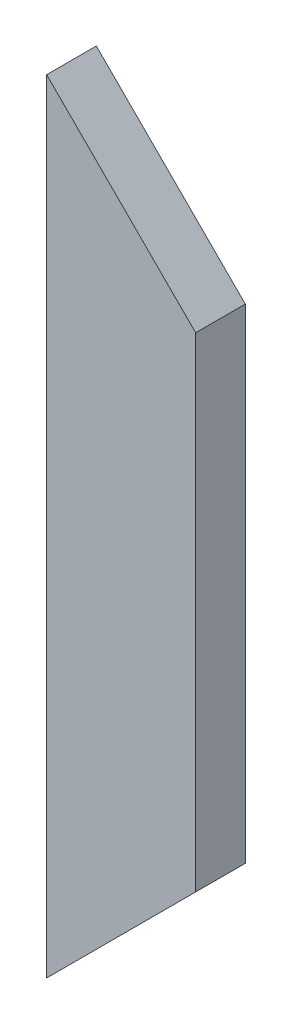
ISO-10303-21;
HEADER;
FILE_DESCRIPTION(('STEP AP214'),'2;1');
FILE_NAME('part.step','',(''),(''),'','','');
FILE_SCHEMA(('AUTOMOTIVE_DESIGN { 1 0 10303 214 1 1 1 1 }'));
ENDSEC;
DATA;
#1=APPLICATION_CONTEXT('core data for automotive mechanical design processes');
#2=APPLICATION_PROTOCOL_DEFINITION('international standard','automotive_design',2000,#1);
#3=PRODUCT_CONTEXT('',#1,'mechanical');
#4=PRODUCT('Part','Part','',(#3));
#5=PRODUCT_RELATED_PRODUCT_CATEGORY('part','',(#4));
#6=PRODUCT_DEFINITION_FORMATION('','',#4);
#7=PRODUCT_DEFINITION_CONTEXT('part definition',#1,'design');
#8=PRODUCT_DEFINITION('design','',#6,#7);
#9=PRODUCT_DEFINITION_SHAPE('','',#8);
#10=(LENGTH_UNIT() NAMED_UNIT(*) SI_UNIT(.MILLI.,.METRE.));
#11=(NAMED_UNIT(*) PLANE_ANGLE_UNIT() SI_UNIT($,.RADIAN.));
#12=(NAMED_UNIT(*) SI_UNIT($,.STERADIAN.) SOLID_ANGLE_UNIT());
#13=UNCERTAINTY_MEASURE_WITH_UNIT(LENGTH_MEASURE(1.E-05),#10,'distance_accuracy_value','');
#14=(GEOMETRIC_REPRESENTATION_CONTEXT(3) GLOBAL_UNCERTAINTY_ASSIGNED_CONTEXT((#13)) GLOBAL_UNIT_ASSIGNED_CONTEXT((#10,
#11,#12)) REPRESENTATION_CONTEXT('',''));
#15=CARTESIAN_POINT('',(0.,0.,0.));
#16=DIRECTION('',(0.,0.,1.));
#17=DIRECTION('',(1.,0.,0.));
#18=AXIS2_PLACEMENT_3D('',#15,#16,#17);
#19=CARTESIAN_POINT('',(38.1,-200.025,25.4));
#20=DIRECTION('',(-1.,0.,0.));
#21=DIRECTION('',(0.,0.,1.));
#22=AXIS2_PLACEMENT_3D('',#19,#20,#21);
#23=PLANE('',#22);
#24=DIRECTION('',(0.,0.,-1.));
#25=VECTOR('',#24,1.);
#26=CARTESIAN_POINT('',(38.1,123.825000000002,25.4));
#27=LINE('',#26,#25);
#28=CARTESIAN_POINT('',(38.1,123.825000000002,25.4));
#29=VERTEX_POINT('',#28);
#30=CARTESIAN_POINT('',(38.1,123.825000000001,0.));
#31=VERTEX_POINT('',#30);
#32=EDGE_CURVE('E48',#29,#31,#27,.T.);
#33=ORIENTED_EDGE('',*,*,#32,.F.);
#34=DIRECTION('',(0.,1.,0.));
#35=VECTOR('',#34,1.);
#36=CARTESIAN_POINT('',(38.1,-200.025,25.4));
#37=LINE('',#36,#35);
#38=CARTESIAN_POINT('',(38.1,-123.824999999998,25.4));
#39=VERTEX_POINT('',#38);
#40=EDGE_CURVE('E78',#39,#29,#37,.T.);
#41=ORIENTED_EDGE('',*,*,#40,.F.);
#42=DIRECTION('',(0.,0.,-1.));
#43=VECTOR('',#42,1.);
#44=CARTESIAN_POINT('',(38.1,-123.824999999998,25.4));
#45=LINE('',#44,#43);
#46=CARTESIAN_POINT('',(38.1,-123.824999999998,0.));
#47=VERTEX_POINT('',#46);
#48=EDGE_CURVE('E94',#39,#47,#45,.T.);
#49=ORIENTED_EDGE('',*,*,#48,.T.);
#50=DIRECTION('',(0.,1.,0.));
#51=VECTOR('',#50,1.);
#52=CARTESIAN_POINT('',(38.1,-200.025,0.));
#53=LINE('',#52,#51);
#54=EDGE_CURVE('E87',#47,#31,#53,.T.);
#55=ORIENTED_EDGE('',*,*,#54,.T.);
#56=EDGE_LOOP('',(#33,#41,#49,#55));
#57=FACE_BOUND('',#56,.T.);
#58=ADVANCED_FACE('F33',(#57),#23,.F.);
#59=CARTESIAN_POINT('',(0.,0.,25.4));
#60=DIRECTION('',(0.,0.,-1.));
#61=DIRECTION('',(-1.,0.,0.));
#62=AXIS2_PLACEMENT_3D('',#59,#60,#61);
#63=PLANE('',#62);
#64=DIRECTION('',(0.707106781186555,-0.70710678118654,0.));
#65=VECTOR('',#64,1.);
#66=CARTESIAN_POINT('',(-38.1,200.025,25.4));
#67=LINE('',#66,#65);
#68=CARTESIAN_POINT('',(-38.1,200.025,25.4));
#69=VERTEX_POINT('',#68);
#70=EDGE_CURVE('E72',#69,#29,#67,.T.);
#71=ORIENTED_EDGE('',*,*,#70,.F.);
#72=DIRECTION('',(0.,1.,0.));
#73=VECTOR('',#72,1.);
#74=CARTESIAN_POINT('',(-38.1,-200.025,25.4));
#75=LINE('',#74,#73);
#76=CARTESIAN_POINT('',(-38.1,-200.025,25.4));
#77=VERTEX_POINT('',#76);
#78=EDGE_CURVE('E84',#77,#69,#75,.T.);
#79=ORIENTED_EDGE('',*,*,#78,.F.);
#80=DIRECTION('',(-0.707106781186539,-0.707106781186555,0.));
#81=VECTOR('',#80,1.);
#82=CARTESIAN_POINT('',(-38.1,-200.025,25.4));
#83=LINE('',#82,#81);
#84=EDGE_CURVE('E101',#39,#77,#83,.T.);
#85=ORIENTED_EDGE('',*,*,#84,.F.);
#86=ORIENTED_EDGE('',*,*,#40,.T.);
#87=EDGE_LOOP('',(#71,#79,#85,#86));
#88=FACE_BOUND('',#87,.T.);
#89=ADVANCED_FACE('F82',(#88),#63,.F.);
#90=CARTESIAN_POINT('',(0.,0.,0.));
#91=DIRECTION('',(0.,0.,-1.));
#92=DIRECTION('',(-1.,0.,0.));
#93=AXIS2_PLACEMENT_3D('',#90,#91,#92);
#94=PLANE('',#93);
#95=DIRECTION('',(0.,1.,0.));
#96=VECTOR('',#95,1.);
#97=CARTESIAN_POINT('',(-38.1,-200.025,0.));
#98=LINE('',#97,#96);
#99=CARTESIAN_POINT('',(-38.1,-200.025,0.));
#100=VERTEX_POINT('',#99);
#101=CARTESIAN_POINT('',(-38.1,200.025,0.));
#102=VERTEX_POINT('',#101);
#103=EDGE_CURVE('E91',#100,#102,#98,.T.);
#104=ORIENTED_EDGE('',*,*,#103,.T.);
#105=DIRECTION('',(0.707106781186555,-0.70710678118654,0.));
#106=VECTOR('',#105,1.);
#107=CARTESIAN_POINT('',(-38.1,200.025,0.));
#108=LINE('',#107,#106);
#109=EDGE_CURVE('E73',#102,#31,#108,.T.);
#110=ORIENTED_EDGE('',*,*,#109,.T.);
#111=ORIENTED_EDGE('',*,*,#54,.F.);
#112=DIRECTION('',(-0.707106781186539,-0.707106781186555,0.));
#113=VECTOR('',#112,1.);
#114=CARTESIAN_POINT('',(-38.1,-200.025,0.));
#115=LINE('',#114,#113);
#116=EDGE_CURVE('E102',#47,#100,#115,.T.);
#117=ORIENTED_EDGE('',*,*,#116,.T.);
#118=EDGE_LOOP('',(#104,#110,#111,#117));
#119=FACE_BOUND('',#118,.T.);
#120=ADVANCED_FACE('F104',(#119),#94,.T.);
#121=CARTESIAN_POINT('',(-38.1,-200.025,25.4));
#122=DIRECTION('',(-1.,0.,0.));
#123=DIRECTION('',(0.,0.,1.));
#124=AXIS2_PLACEMENT_3D('',#121,#122,#123);
#125=PLANE('',#124);
#126=ORIENTED_EDGE('',*,*,#103,.F.);
#127=DIRECTION('',(0.,0.,-1.));
#128=VECTOR('',#127,1.);
#129=CARTESIAN_POINT('',(-38.1,-200.025,25.4));
#130=LINE('',#129,#128);
#131=EDGE_CURVE('E11',#77,#100,#130,.T.);
#132=ORIENTED_EDGE('',*,*,#131,.F.);
#133=ORIENTED_EDGE('',*,*,#78,.T.);
#134=DIRECTION('',(0.,0.,-1.));
#135=VECTOR('',#134,1.);
#136=CARTESIAN_POINT('',(-38.1,200.025,25.4));
#137=LINE('',#136,#135);
#138=EDGE_CURVE('E37',#69,#102,#137,.T.);
#139=ORIENTED_EDGE('',*,*,#138,.T.);
#140=EDGE_LOOP('',(#126,#132,#133,#139));
#141=FACE_BOUND('',#140,.T.);
#142=ADVANCED_FACE('F35',(#141),#125,.T.);
#143=CARTESIAN_POINT('',(-38.1,-200.025,25.4));
#144=DIRECTION('',(0.707106781186556,-0.707106781186539,0.));
#145=DIRECTION('',(0.707106781186539,0.707106781186556,0.));
#146=AXIS2_PLACEMENT_3D('',#143,#144,#145);
#147=PLANE('',#146);
#148=ORIENTED_EDGE('',*,*,#116,.F.);
#149=ORIENTED_EDGE('',*,*,#48,.F.);
#150=ORIENTED_EDGE('',*,*,#84,.T.);
#151=ORIENTED_EDGE('',*,*,#131,.T.);
#152=EDGE_LOOP('',(#148,#149,#150,#151));
#153=FACE_BOUND('',#152,.T.);
#154=ADVANCED_FACE('F106',(#153),#147,.T.);
#155=CARTESIAN_POINT('',(-38.1,200.025,25.4));
#156=DIRECTION('',(0.70710678118654,0.707106781186555,0.));
#157=DIRECTION('',(-0.707106781186555,0.70710678118654,0.));
#158=AXIS2_PLACEMENT_3D('',#155,#156,#157);
#159=PLANE('',#158);
#160=ORIENTED_EDGE('',*,*,#109,.F.);
#161=ORIENTED_EDGE('',*,*,#138,.F.);
#162=ORIENTED_EDGE('',*,*,#70,.T.);
#163=ORIENTED_EDGE('',*,*,#32,.T.);
#164=EDGE_LOOP('',(#160,#161,#162,#163));
#165=FACE_BOUND('',#164,.T.);
#166=ADVANCED_FACE('F71',(#165),#159,.T.);
#167=CLOSED_SHELL('',(#58,#89,#120,#142,#154,#166));
#168=MANIFOLD_SOLID_BREP('B2',#167);
#169=ADVANCED_BREP_SHAPE_REPRESENTATION('',(#18,#168),#14);
#170=SHAPE_DEFINITION_REPRESENTATION(#9,#169);
ENDSEC;
END-ISO-10303-21;
